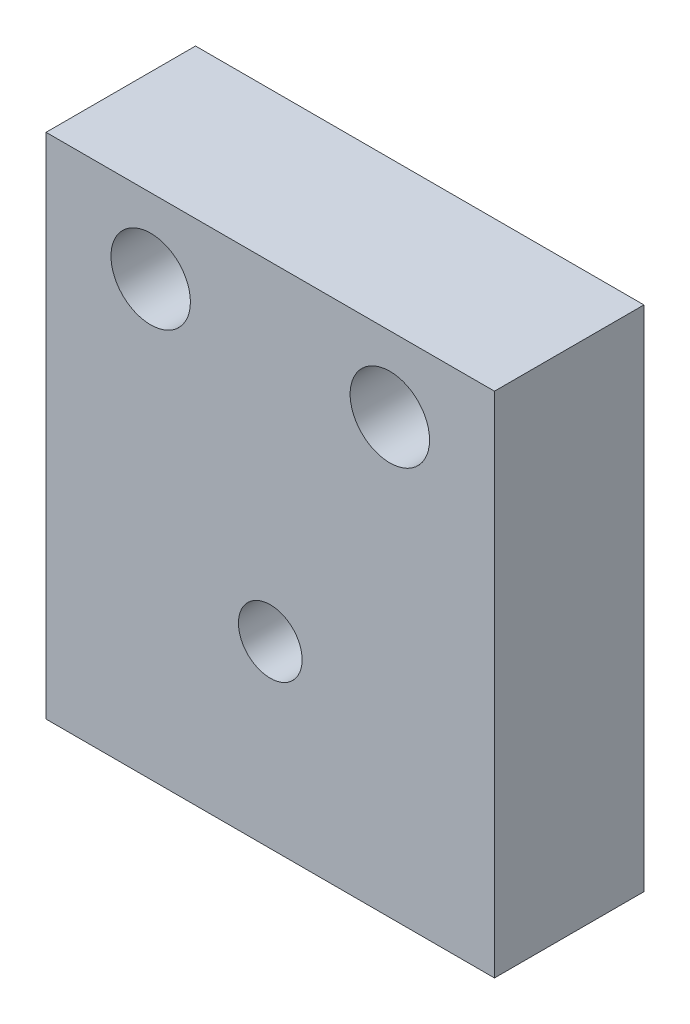
ISO-10303-21;
HEADER;
FILE_DESCRIPTION(('STEP AP214'),'2;1');
FILE_NAME('part.step','',(''),(''),'','','');
FILE_SCHEMA(('AUTOMOTIVE_DESIGN { 1 0 10303 214 1 1 1 1 }'));
ENDSEC;
DATA;
#1=APPLICATION_CONTEXT('core data for automotive mechanical design processes');
#2=APPLICATION_PROTOCOL_DEFINITION('international standard','automotive_design',2000,#1);
#3=PRODUCT_CONTEXT('',#1,'mechanical');
#4=PRODUCT('Part','Part','',(#3));
#5=PRODUCT_RELATED_PRODUCT_CATEGORY('part','',(#4));
#6=PRODUCT_DEFINITION_FORMATION('','',#4);
#7=PRODUCT_DEFINITION_CONTEXT('part definition',#1,'design');
#8=PRODUCT_DEFINITION('design','',#6,#7);
#9=PRODUCT_DEFINITION_SHAPE('','',#8);
#10=(LENGTH_UNIT() NAMED_UNIT(*) SI_UNIT(.MILLI.,.METRE.));
#11=(NAMED_UNIT(*) PLANE_ANGLE_UNIT() SI_UNIT($,.RADIAN.));
#12=(NAMED_UNIT(*) SI_UNIT($,.STERADIAN.) SOLID_ANGLE_UNIT());
#13=UNCERTAINTY_MEASURE_WITH_UNIT(LENGTH_MEASURE(1.E-05),#10,'distance_accuracy_value','');
#14=(GEOMETRIC_REPRESENTATION_CONTEXT(3) GLOBAL_UNCERTAINTY_ASSIGNED_CONTEXT((#13)) GLOBAL_UNIT_ASSIGNED_CONTEXT((#10,
#11,#12)) REPRESENTATION_CONTEXT('',''));
#15=CARTESIAN_POINT('',(0.,0.,0.));
#16=DIRECTION('',(0.,0.,1.));
#17=DIRECTION('',(1.,0.,0.));
#18=AXIS2_PLACEMENT_3D('',#15,#16,#17);
#19=CARTESIAN_POINT('',(0.,0.,-12.7));
#20=DIRECTION('',(-1.,0.,0.));
#21=DIRECTION('',(0.,0.,1.));
#22=AXIS2_PLACEMENT_3D('',#19,#20,#21);
#23=PLANE('',#22);
#24=CARTESIAN_POINT('',(0.,27.94,-6.35));
#25=DIRECTION('',(-1.,0.,0.));
#26=DIRECTION('',(0.,0.,1.));
#27=AXIS2_PLACEMENT_3D('',#24,#25,#26);
#28=CIRCLE('',#27,2.55269999999999);
#29=CARTESIAN_POINT('',(0.,27.94,-3.79730000000001));
#30=VERTEX_POINT('',#29);
#31=EDGE_CURVE('E100',#30,#30,#28,.T.);
#32=ORIENTED_EDGE('',*,*,#31,.F.);
#33=EDGE_LOOP('',(#32));
#34=FACE_BOUND('',#33,.T.);
#35=DIRECTION('',(0.,-1.,0.));
#36=VECTOR('',#35,1.);
#37=CARTESIAN_POINT('',(0.,0.,0.));
#38=LINE('',#37,#36);
#39=CARTESIAN_POINT('',(0.,43.18,0.));
#40=VERTEX_POINT('',#39);
#41=CARTESIAN_POINT('',(0.,0.,0.));
#42=VERTEX_POINT('',#41);
#43=EDGE_CURVE('E118',#40,#42,#38,.T.);
#44=ORIENTED_EDGE('',*,*,#43,.F.);
#45=DIRECTION('',(0.,0.,1.));
#46=VECTOR('',#45,1.);
#47=CARTESIAN_POINT('',(0.,43.18,-12.7));
#48=LINE('',#47,#46);
#49=CARTESIAN_POINT('',(0.,43.18,-12.7));
#50=VERTEX_POINT('',#49);
#51=EDGE_CURVE('E11',#50,#40,#48,.T.);
#52=ORIENTED_EDGE('',*,*,#51,.F.);
#53=DIRECTION('',(0.,-1.,0.));
#54=VECTOR('',#53,1.);
#55=CARTESIAN_POINT('',(0.,0.,-12.7));
#56=LINE('',#55,#54);
#57=CARTESIAN_POINT('',(0.,0.,-12.7));
#58=VERTEX_POINT('',#57);
#59=EDGE_CURVE('E119',#50,#58,#56,.T.);
#60=ORIENTED_EDGE('',*,*,#59,.T.);
#61=DIRECTION('',(0.,0.,1.));
#62=VECTOR('',#61,1.);
#63=CARTESIAN_POINT('',(0.,0.,-12.7));
#64=LINE('',#63,#62);
#65=EDGE_CURVE('E43',#58,#42,#64,.T.);
#66=ORIENTED_EDGE('',*,*,#65,.T.);
#67=EDGE_LOOP('',(#44,#52,#60,#66));
#68=FACE_BOUND('',#67,.T.);
#69=ADVANCED_FACE('F40',(#34,#68),#23,.T.);
#70=CARTESIAN_POINT('',(0.,43.18,-12.7));
#71=DIRECTION('',(0.,1.,0.));
#72=DIRECTION('',(0.,0.,1.));
#73=AXIS2_PLACEMENT_3D('',#70,#71,#72);
#74=PLANE('',#73);
#75=DIRECTION('',(-1.,0.,0.));
#76=VECTOR('',#75,1.);
#77=CARTESIAN_POINT('',(0.,43.18,0.));
#78=LINE('',#77,#76);
#79=CARTESIAN_POINT('',(38.1,43.18,0.));
#80=VERTEX_POINT('',#79);
#81=EDGE_CURVE('E122',#80,#40,#78,.T.);
#82=ORIENTED_EDGE('',*,*,#81,.F.);
#83=DIRECTION('',(0.,0.,1.));
#84=VECTOR('',#83,1.);
#85=CARTESIAN_POINT('',(38.1,43.18,-12.7));
#86=LINE('',#85,#84);
#87=CARTESIAN_POINT('',(38.1,43.18,-12.7));
#88=VERTEX_POINT('',#87);
#89=EDGE_CURVE('E49',#88,#80,#86,.T.);
#90=ORIENTED_EDGE('',*,*,#89,.F.);
#91=DIRECTION('',(-1.,0.,0.));
#92=VECTOR('',#91,1.);
#93=CARTESIAN_POINT('',(0.,43.18,-12.7));
#94=LINE('',#93,#92);
#95=EDGE_CURVE('E126',#88,#50,#94,.T.);
#96=ORIENTED_EDGE('',*,*,#95,.T.);
#97=ORIENTED_EDGE('',*,*,#51,.T.);
#98=EDGE_LOOP('',(#82,#90,#96,#97));
#99=FACE_BOUND('',#98,.T.);
#100=ADVANCED_FACE('F141',(#99),#74,.T.);
#101=CARTESIAN_POINT('',(38.1,0.,-12.7));
#102=DIRECTION('',(1.,0.,0.));
#103=DIRECTION('',(0.,0.,-1.));
#104=AXIS2_PLACEMENT_3D('',#101,#102,#103);
#105=PLANE('',#104);
#106=DIRECTION('',(0.,1.,0.));
#107=VECTOR('',#106,1.);
#108=CARTESIAN_POINT('',(38.1,0.,0.));
#109=LINE('',#108,#107);
#110=CARTESIAN_POINT('',(38.1,0.,0.));
#111=VERTEX_POINT('',#110);
#112=EDGE_CURVE('E133',#111,#80,#109,.T.);
#113=ORIENTED_EDGE('',*,*,#112,.F.);
#114=DIRECTION('',(0.,0.,1.));
#115=VECTOR('',#114,1.);
#116=CARTESIAN_POINT('',(38.1,0.,-12.7));
#117=LINE('',#116,#115);
#118=CARTESIAN_POINT('',(38.1,0.,-12.7));
#119=VERTEX_POINT('',#118);
#120=EDGE_CURVE('E137',#119,#111,#117,.T.);
#121=ORIENTED_EDGE('',*,*,#120,.F.);
#122=DIRECTION('',(0.,1.,0.));
#123=VECTOR('',#122,1.);
#124=CARTESIAN_POINT('',(38.1,0.,-12.7));
#125=LINE('',#124,#123);
#126=EDGE_CURVE('E124',#119,#88,#125,.T.);
#127=ORIENTED_EDGE('',*,*,#126,.T.);
#128=ORIENTED_EDGE('',*,*,#89,.T.);
#129=EDGE_LOOP('',(#113,#121,#127,#128));
#130=FACE_BOUND('',#129,.T.);
#131=ADVANCED_FACE('F144',(#130),#105,.T.);
#132=CARTESIAN_POINT('',(0.,0.,-12.7));
#133=DIRECTION('',(0.,-1.,0.));
#134=DIRECTION('',(0.,0.,-1.));
#135=AXIS2_PLACEMENT_3D('',#132,#133,#134);
#136=PLANE('',#135);
#137=DIRECTION('',(1.,0.,0.));
#138=VECTOR('',#137,1.);
#139=CARTESIAN_POINT('',(0.,0.,0.));
#140=LINE('',#139,#138);
#141=EDGE_CURVE('E130',#42,#111,#140,.T.);
#142=ORIENTED_EDGE('',*,*,#141,.F.);
#143=ORIENTED_EDGE('',*,*,#65,.F.);
#144=DIRECTION('',(1.,0.,0.));
#145=VECTOR('',#144,1.);
#146=CARTESIAN_POINT('',(0.,0.,-12.7));
#147=LINE('',#146,#145);
#148=EDGE_CURVE('E121',#58,#119,#147,.T.);
#149=ORIENTED_EDGE('',*,*,#148,.T.);
#150=ORIENTED_EDGE('',*,*,#120,.T.);
#151=EDGE_LOOP('',(#142,#143,#149,#150));
#152=FACE_BOUND('',#151,.T.);
#153=ADVANCED_FACE('F138',(#152),#136,.T.);
#154=CARTESIAN_POINT('',(0.,0.,-12.7));
#155=DIRECTION('',(0.,0.,-1.));
#156=DIRECTION('',(-1.,0.,0.));
#157=AXIS2_PLACEMENT_3D('',#154,#155,#156);
#158=PLANE('',#157);
#159=CARTESIAN_POINT('',(19.05,15.24,-12.7));
#160=DIRECTION('',(0.,0.,1.));
#161=DIRECTION('',(1.,0.,0.));
#162=AXIS2_PLACEMENT_3D('',#159,#160,#161);
#163=CIRCLE('',#162,2.7051);
#164=CARTESIAN_POINT('',(21.7551,15.24,-12.7));
#165=VERTEX_POINT('',#164);
#166=EDGE_CURVE('E106',#165,#165,#163,.T.);
#167=ORIENTED_EDGE('',*,*,#166,.T.);
#168=EDGE_LOOP('',(#167));
#169=FACE_BOUND('',#168,.T.);
#170=CARTESIAN_POINT('',(29.21,36.83,-12.7));
#171=DIRECTION('',(0.,0.,1.));
#172=DIRECTION('',(1.,0.,0.));
#173=AXIS2_PLACEMENT_3D('',#170,#171,#172);
#174=CIRCLE('',#173,3.37350099999999);
#175=CARTESIAN_POINT('',(32.583501,36.83,-12.7));
#176=VERTEX_POINT('',#175);
#177=EDGE_CURVE('E103',#176,#176,#174,.T.);
#178=ORIENTED_EDGE('',*,*,#177,.T.);
#179=EDGE_LOOP('',(#178));
#180=FACE_BOUND('',#179,.T.);
#181=CARTESIAN_POINT('',(8.89,36.83,-12.7));
#182=DIRECTION('',(0.,0.,1.));
#183=DIRECTION('',(1.,0.,0.));
#184=AXIS2_PLACEMENT_3D('',#181,#182,#183);
#185=CIRCLE('',#184,3.373501);
#186=CARTESIAN_POINT('',(12.263501,36.83,-12.7));
#187=VERTEX_POINT('',#186);
#188=EDGE_CURVE('E115',#187,#187,#185,.T.);
#189=ORIENTED_EDGE('',*,*,#188,.T.);
#190=EDGE_LOOP('',(#189));
#191=FACE_BOUND('',#190,.T.);
#192=ORIENTED_EDGE('',*,*,#59,.F.);
#193=ORIENTED_EDGE('',*,*,#95,.F.);
#194=ORIENTED_EDGE('',*,*,#126,.F.);
#195=ORIENTED_EDGE('',*,*,#148,.F.);
#196=EDGE_LOOP('',(#192,#193,#194,#195));
#197=FACE_BOUND('',#196,.T.);
#198=ADVANCED_FACE('F146',(#169,#180,#191,#197),#158,.T.);
#199=CARTESIAN_POINT('',(0.,0.,0.));
#200=DIRECTION('',(0.,0.,-1.));
#201=DIRECTION('',(-1.,0.,0.));
#202=AXIS2_PLACEMENT_3D('',#199,#200,#201);
#203=PLANE('',#202);
#204=CARTESIAN_POINT('',(19.05,15.24,0.));
#205=DIRECTION('',(0.,0.,1.));
#206=DIRECTION('',(1.,0.,0.));
#207=AXIS2_PLACEMENT_3D('',#204,#205,#206);
#208=CIRCLE('',#207,2.7051);
#209=CARTESIAN_POINT('',(21.7551,15.24,0.));
#210=VERTEX_POINT('',#209);
#211=EDGE_CURVE('E262',#210,#210,#208,.T.);
#212=ORIENTED_EDGE('',*,*,#211,.F.);
#213=EDGE_LOOP('',(#212));
#214=FACE_BOUND('',#213,.T.);
#215=CARTESIAN_POINT('',(29.21,36.83,0.));
#216=DIRECTION('',(0.,0.,1.));
#217=DIRECTION('',(1.,0.,0.));
#218=AXIS2_PLACEMENT_3D('',#215,#216,#217);
#219=CIRCLE('',#218,3.373501);
#220=CARTESIAN_POINT('',(32.583501,36.83,0.));
#221=VERTEX_POINT('',#220);
#222=EDGE_CURVE('E99',#221,#221,#219,.T.);
#223=ORIENTED_EDGE('',*,*,#222,.F.);
#224=EDGE_LOOP('',(#223));
#225=FACE_BOUND('',#224,.T.);
#226=CARTESIAN_POINT('',(8.89,36.83,0.));
#227=DIRECTION('',(0.,0.,1.));
#228=DIRECTION('',(1.,0.,0.));
#229=AXIS2_PLACEMENT_3D('',#226,#227,#228);
#230=CIRCLE('',#229,3.373501);
#231=CARTESIAN_POINT('',(12.263501,36.83,0.));
#232=VERTEX_POINT('',#231);
#233=EDGE_CURVE('E112',#232,#232,#230,.T.);
#234=ORIENTED_EDGE('',*,*,#233,.F.);
#235=EDGE_LOOP('',(#234));
#236=FACE_BOUND('',#235,.T.);
#237=ORIENTED_EDGE('',*,*,#43,.T.);
#238=ORIENTED_EDGE('',*,*,#141,.T.);
#239=ORIENTED_EDGE('',*,*,#112,.T.);
#240=ORIENTED_EDGE('',*,*,#81,.T.);
#241=EDGE_LOOP('',(#237,#238,#239,#240));
#242=FACE_BOUND('',#241,.T.);
#243=ADVANCED_FACE('F140',(#214,#225,#236,#242),#203,.F.);
#244=CARTESIAN_POINT('',(8.89,36.83,0.));
#245=DIRECTION('',(0.,0.,1.));
#246=DIRECTION('',(1.,0.,0.));
#247=AXIS2_PLACEMENT_3D('',#244,#245,#246);
#248=CYLINDRICAL_SURFACE('',#247,3.373501);
#249=ORIENTED_EDGE('',*,*,#188,.F.);
#250=EDGE_LOOP('',(#249));
#251=FACE_BOUND('',#250,.T.);
#252=ORIENTED_EDGE('',*,*,#233,.T.);
#253=EDGE_LOOP('',(#252));
#254=FACE_BOUND('',#253,.T.);
#255=ADVANCED_FACE('F154',(#251,#254),#248,.F.);
#256=CARTESIAN_POINT('',(29.21,36.83,0.));
#257=DIRECTION('',(0.,0.,1.));
#258=DIRECTION('',(1.,0.,0.));
#259=AXIS2_PLACEMENT_3D('',#256,#257,#258);
#260=CYLINDRICAL_SURFACE('',#259,3.373501);
#261=ORIENTED_EDGE('',*,*,#177,.F.);
#262=EDGE_LOOP('',(#261));
#263=FACE_BOUND('',#262,.T.);
#264=ORIENTED_EDGE('',*,*,#222,.T.);
#265=EDGE_LOOP('',(#264));
#266=FACE_BOUND('',#265,.T.);
#267=ADVANCED_FACE('F93',(#263,#266),#260,.F.);
#268=CARTESIAN_POINT('',(12.7,27.94,-6.35));
#269=DIRECTION('',(-1.,0.,0.));
#270=DIRECTION('',(0.,0.,1.));
#271=AXIS2_PLACEMENT_3D('',#268,#269,#270);
#272=CONICAL_SURFACE('',#271,2.5527,1.02974425867665);
#273=CARTESIAN_POINT('',(14.2338169021917,27.94,-6.35));
#274=VERTEX_POINT('',#273);
#275=VERTEX_LOOP('',#274);
#276=FACE_BOUND('',#275,.T.);
#277=CARTESIAN_POINT('',(12.7,27.94,-6.35));
#278=DIRECTION('',(-1.,0.,0.));
#279=DIRECTION('',(0.,0.,1.));
#280=AXIS2_PLACEMENT_3D('',#277,#278,#279);
#281=CIRCLE('',#280,2.5527);
#282=CARTESIAN_POINT('',(12.7,27.94,-3.7973));
#283=VERTEX_POINT('',#282);
#284=EDGE_CURVE('E97',#283,#283,#281,.T.);
#285=ORIENTED_EDGE('',*,*,#284,.T.);
#286=EDGE_LOOP('',(#285));
#287=FACE_BOUND('',#286,.T.);
#288=ADVANCED_FACE('F89',(#276,#287),#272,.F.);
#289=CARTESIAN_POINT('',(0.,27.94,-6.35));
#290=DIRECTION('',(-1.,0.,0.));
#291=DIRECTION('',(0.,0.,1.));
#292=AXIS2_PLACEMENT_3D('',#289,#290,#291);
#293=CYLINDRICAL_SURFACE('',#292,2.55269999999999);
#294=ORIENTED_EDGE('',*,*,#284,.F.);
#295=EDGE_LOOP('',(#294));
#296=FACE_BOUND('',#295,.T.);
#297=ORIENTED_EDGE('',*,*,#31,.T.);
#298=EDGE_LOOP('',(#297));
#299=FACE_BOUND('',#298,.T.);
#300=ADVANCED_FACE('F92',(#296,#299),#293,.F.);
#301=CARTESIAN_POINT('',(19.05,15.24,0.));
#302=DIRECTION('',(0.,0.,1.));
#303=DIRECTION('',(1.,0.,0.));
#304=AXIS2_PLACEMENT_3D('',#301,#302,#303);
#305=CYLINDRICAL_SURFACE('',#304,2.7051);
#306=ORIENTED_EDGE('',*,*,#166,.F.);
#307=EDGE_LOOP('',(#306));
#308=FACE_BOUND('',#307,.T.);
#309=ORIENTED_EDGE('',*,*,#211,.T.);
#310=EDGE_LOOP('',(#309));
#311=FACE_BOUND('',#310,.T.);
#312=ADVANCED_FACE('F169',(#308,#311),#305,.F.);
#313=CLOSED_SHELL('',(#69,#100,#131,#153,#198,#243,#255,#267,#288,#300,#312));
#314=MANIFOLD_SOLID_BREP('B2',#313);
#315=ADVANCED_BREP_SHAPE_REPRESENTATION('',(#18,#314),#14);
#316=SHAPE_DEFINITION_REPRESENTATION(#9,#315);
ENDSEC;
END-ISO-10303-21;
